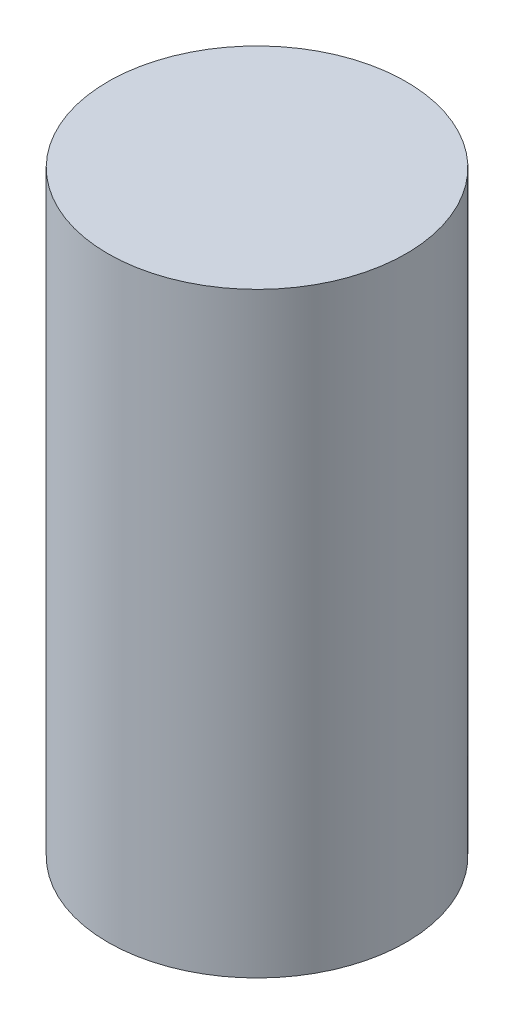
ISO-10303-21;
HEADER;
FILE_DESCRIPTION(('STEP AP214'),'2;1');
FILE_NAME('part.step','',(''),(''),'','','');
FILE_SCHEMA(('AUTOMOTIVE_DESIGN { 1 0 10303 214 1 1 1 1 }'));
ENDSEC;
DATA;
#1=APPLICATION_CONTEXT('core data for automotive mechanical design processes');
#2=APPLICATION_PROTOCOL_DEFINITION('international standard','automotive_design',2000,#1);
#3=PRODUCT_CONTEXT('',#1,'mechanical');
#4=PRODUCT('Part','Part','',(#3));
#5=PRODUCT_RELATED_PRODUCT_CATEGORY('part','',(#4));
#6=PRODUCT_DEFINITION_FORMATION('','',#4);
#7=PRODUCT_DEFINITION_CONTEXT('part definition',#1,'design');
#8=PRODUCT_DEFINITION('design','',#6,#7);
#9=PRODUCT_DEFINITION_SHAPE('','',#8);
#10=(LENGTH_UNIT() NAMED_UNIT(*) SI_UNIT(.MILLI.,.METRE.));
#11=(NAMED_UNIT(*) PLANE_ANGLE_UNIT() SI_UNIT($,.RADIAN.));
#12=(NAMED_UNIT(*) SI_UNIT($,.STERADIAN.) SOLID_ANGLE_UNIT());
#13=UNCERTAINTY_MEASURE_WITH_UNIT(LENGTH_MEASURE(1.E-05),#10,'distance_accuracy_value','');
#14=(GEOMETRIC_REPRESENTATION_CONTEXT(3) GLOBAL_UNCERTAINTY_ASSIGNED_CONTEXT((#13)) GLOBAL_UNIT_ASSIGNED_CONTEXT((#10,
#11,#12)) REPRESENTATION_CONTEXT('',''));
#15=CARTESIAN_POINT('',(0.,0.,0.));
#16=DIRECTION('',(0.,0.,1.));
#17=DIRECTION('',(1.,0.,0.));
#18=AXIS2_PLACEMENT_3D('',#15,#16,#17);
#19=CARTESIAN_POINT('',(0.,6.,0.));
#20=DIRECTION('',(0.,-1.,0.));
#21=DIRECTION('',(0.,0.,-1.));
#22=AXIS2_PLACEMENT_3D('',#19,#20,#21);
#23=CYLINDRICAL_SURFACE('',#22,1.5);
#24=CARTESIAN_POINT('',(0.,6.,0.));
#25=DIRECTION('',(0.,1.,0.));
#26=DIRECTION('',(0.,0.,1.));
#27=AXIS2_PLACEMENT_3D('',#24,#25,#26);
#28=CIRCLE('',#27,1.5);
#29=CARTESIAN_POINT('',(0.,6.,1.5));
#30=VERTEX_POINT('',#29);
#31=EDGE_CURVE('E10',#30,#30,#28,.T.);
#32=ORIENTED_EDGE('',*,*,#31,.F.);
#33=EDGE_LOOP('',(#32));
#34=FACE_BOUND('',#33,.T.);
#35=CARTESIAN_POINT('',(0.,0.,0.));
#36=DIRECTION('',(0.,1.,0.));
#37=DIRECTION('',(0.,0.,1.));
#38=AXIS2_PLACEMENT_3D('',#35,#36,#37);
#39=CIRCLE('',#38,1.5);
#40=CARTESIAN_POINT('',(0.,0.,1.5));
#41=VERTEX_POINT('',#40);
#42=EDGE_CURVE('E40',#41,#41,#39,.T.);
#43=ORIENTED_EDGE('',*,*,#42,.T.);
#44=EDGE_LOOP('',(#43));
#45=FACE_BOUND('',#44,.T.);
#46=ADVANCED_FACE('F37',(#34,#45),#23,.T.);
#47=CARTESIAN_POINT('',(0.,6.,0.));
#48=DIRECTION('',(0.,1.,0.));
#49=DIRECTION('',(0.,0.,1.));
#50=AXIS2_PLACEMENT_3D('',#47,#48,#49);
#51=PLANE('',#50);
#52=ORIENTED_EDGE('',*,*,#31,.T.);
#53=EDGE_LOOP('',(#52));
#54=FACE_BOUND('',#53,.T.);
#55=ADVANCED_FACE('F54',(#54),#51,.T.);
#56=CARTESIAN_POINT('',(0.,0.,0.));
#57=DIRECTION('',(0.,1.,0.));
#58=DIRECTION('',(0.,0.,1.));
#59=AXIS2_PLACEMENT_3D('',#56,#57,#58);
#60=PLANE('',#59);
#61=ORIENTED_EDGE('',*,*,#42,.F.);
#62=EDGE_LOOP('',(#61));
#63=FACE_BOUND('',#62,.T.);
#64=ADVANCED_FACE('F52',(#63),#60,.F.);
#65=CLOSED_SHELL('',(#46,#55,#64));
#66=MANIFOLD_SOLID_BREP('B2',#65);
#67=ADVANCED_BREP_SHAPE_REPRESENTATION('',(#18,#66),#14);
#68=SHAPE_DEFINITION_REPRESENTATION(#9,#67);
ENDSEC;
END-ISO-10303-21;
